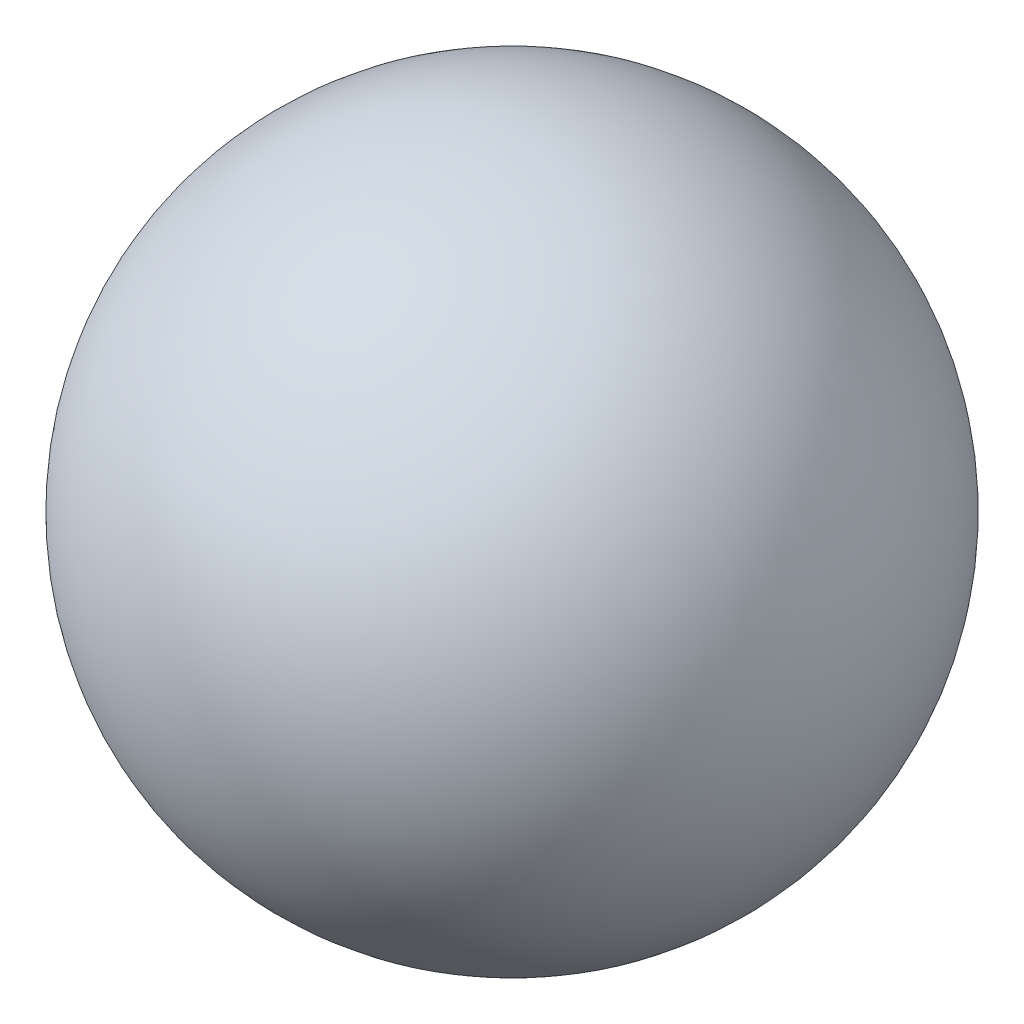
ISO-10303-21;
HEADER;
FILE_DESCRIPTION(('STEP AP214'),'2;1');
FILE_NAME('part.step','',(''),(''),'','','');
FILE_SCHEMA(('AUTOMOTIVE_DESIGN { 1 0 10303 214 1 1 1 1 }'));
ENDSEC;
DATA;
#1=APPLICATION_CONTEXT('core data for automotive mechanical design processes');
#2=APPLICATION_PROTOCOL_DEFINITION('international standard','automotive_design',2000,#1);
#3=PRODUCT_CONTEXT('',#1,'mechanical');
#4=PRODUCT('Part','Part','',(#3));
#5=PRODUCT_RELATED_PRODUCT_CATEGORY('part','',(#4));
#6=PRODUCT_DEFINITION_FORMATION('','',#4);
#7=PRODUCT_DEFINITION_CONTEXT('part definition',#1,'design');
#8=PRODUCT_DEFINITION('design','',#6,#7);
#9=PRODUCT_DEFINITION_SHAPE('','',#8);
#10=(LENGTH_UNIT() NAMED_UNIT(*) SI_UNIT(.MILLI.,.METRE.));
#11=(NAMED_UNIT(*) PLANE_ANGLE_UNIT() SI_UNIT($,.RADIAN.));
#12=(NAMED_UNIT(*) SI_UNIT($,.STERADIAN.) SOLID_ANGLE_UNIT());
#13=UNCERTAINTY_MEASURE_WITH_UNIT(LENGTH_MEASURE(1.E-05),#10,'distance_accuracy_value','');
#14=(GEOMETRIC_REPRESENTATION_CONTEXT(3) GLOBAL_UNCERTAINTY_ASSIGNED_CONTEXT((#13)) GLOBAL_UNIT_ASSIGNED_CONTEXT((#10,
#11,#12)) REPRESENTATION_CONTEXT('',''));
#15=CARTESIAN_POINT('',(0.,0.,0.));
#16=DIRECTION('',(0.,0.,1.));
#17=DIRECTION('',(1.,0.,0.));
#18=AXIS2_PLACEMENT_3D('',#15,#16,#17);
#19=CARTESIAN_POINT('',(0.,0.,0.));
#20=DIRECTION('',(0.,1.,0.));
#21=DIRECTION('',(1.,0.,0.));
#22=AXIS2_PLACEMENT_3D('',#19,#20,#21);
#23=SPHERICAL_SURFACE('',#22,9.);
#24=CARTESIAN_POINT('',(0.,9.,0.));
#25=VERTEX_POINT('',#24);
#26=VERTEX_LOOP('',#25);
#27=FACE_BOUND('',#26,.T.);
#28=ADVANCED_FACE('F31',(#27),#23,.T.);
#29=CLOSED_SHELL('',(#28));
#30=MANIFOLD_SOLID_BREP('B2',#29);
#31=ADVANCED_BREP_SHAPE_REPRESENTATION('',(#18,#30),#14);
#32=SHAPE_DEFINITION_REPRESENTATION(#9,#31);
ENDSEC;
END-ISO-10303-21;
